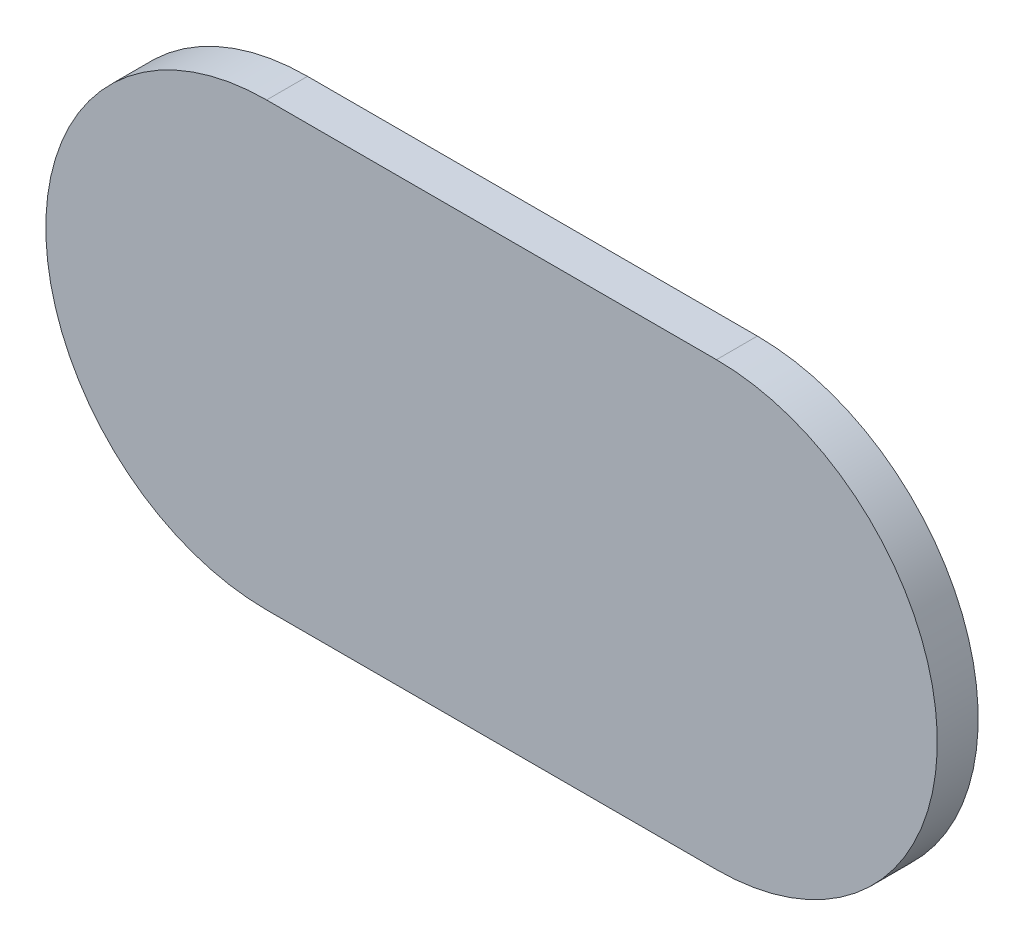
ISO-10303-21;
HEADER;
FILE_DESCRIPTION(('STEP AP214'),'2;1');
FILE_NAME('part.step','',(''),(''),'','','');
FILE_SCHEMA(('AUTOMOTIVE_DESIGN { 1 0 10303 214 1 1 1 1 }'));
ENDSEC;
DATA;
#1=APPLICATION_CONTEXT('core data for automotive mechanical design processes');
#2=APPLICATION_PROTOCOL_DEFINITION('international standard','automotive_design',2000,#1);
#3=PRODUCT_CONTEXT('',#1,'mechanical');
#4=PRODUCT('Part','Part','',(#3));
#5=PRODUCT_RELATED_PRODUCT_CATEGORY('part','',(#4));
#6=PRODUCT_DEFINITION_FORMATION('','',#4);
#7=PRODUCT_DEFINITION_CONTEXT('part definition',#1,'design');
#8=PRODUCT_DEFINITION('design','',#6,#7);
#9=PRODUCT_DEFINITION_SHAPE('','',#8);
#10=(LENGTH_UNIT() NAMED_UNIT(*) SI_UNIT(.MILLI.,.METRE.));
#11=(NAMED_UNIT(*) PLANE_ANGLE_UNIT() SI_UNIT($,.RADIAN.));
#12=(NAMED_UNIT(*) SI_UNIT($,.STERADIAN.) SOLID_ANGLE_UNIT());
#13=UNCERTAINTY_MEASURE_WITH_UNIT(LENGTH_MEASURE(1.E-05),#10,'distance_accuracy_value','');
#14=(GEOMETRIC_REPRESENTATION_CONTEXT(3) GLOBAL_UNCERTAINTY_ASSIGNED_CONTEXT((#13)) GLOBAL_UNIT_ASSIGNED_CONTEXT((#10,
#11,#12)) REPRESENTATION_CONTEXT('',''));
#15=CARTESIAN_POINT('',(0.,0.,0.));
#16=DIRECTION('',(0.,0.,1.));
#17=DIRECTION('',(1.,0.,0.));
#18=AXIS2_PLACEMENT_3D('',#15,#16,#17);
#19=CARTESIAN_POINT('',(2.75,0.,0.5));
#20=DIRECTION('',(0.,0.,-1.));
#21=DIRECTION('',(-1.,0.,0.));
#22=AXIS2_PLACEMENT_3D('',#19,#20,#21);
#23=CYLINDRICAL_SURFACE('',#22,2.7);
#24=CARTESIAN_POINT('',(2.75,0.,0.));
#25=DIRECTION('',(0.,0.,1.));
#26=DIRECTION('',(1.,0.,0.));
#27=AXIS2_PLACEMENT_3D('',#24,#25,#26);
#28=CIRCLE('',#27,2.7);
#29=CARTESIAN_POINT('',(2.75,-2.7,0.));
#30=VERTEX_POINT('',#29);
#31=CARTESIAN_POINT('',(2.75,2.7,0.));
#32=VERTEX_POINT('',#31);
#33=EDGE_CURVE('E104',#30,#32,#28,.T.);
#34=ORIENTED_EDGE('',*,*,#33,.T.);
#35=DIRECTION('',(0.,0.,-1.));
#36=VECTOR('',#35,1.);
#37=CARTESIAN_POINT('',(2.75,2.7,0.5));
#38=LINE('',#37,#36);
#39=CARTESIAN_POINT('',(2.75,2.7,0.5));
#40=VERTEX_POINT('',#39);
#41=EDGE_CURVE('E11',#40,#32,#38,.T.);
#42=ORIENTED_EDGE('',*,*,#41,.F.);
#43=CARTESIAN_POINT('',(2.75,0.,0.5));
#44=DIRECTION('',(0.,0.,1.));
#45=DIRECTION('',(1.,0.,0.));
#46=AXIS2_PLACEMENT_3D('',#43,#44,#45);
#47=CIRCLE('',#46,2.7);
#48=CARTESIAN_POINT('',(2.75,-2.7,0.5));
#49=VERTEX_POINT('',#48);
#50=EDGE_CURVE('E92',#49,#40,#47,.T.);
#51=ORIENTED_EDGE('',*,*,#50,.F.);
#52=DIRECTION('',(0.,0.,-1.));
#53=VECTOR('',#52,1.);
#54=CARTESIAN_POINT('',(2.75,-2.7,0.5));
#55=LINE('',#54,#53);
#56=EDGE_CURVE('E100',#49,#30,#55,.T.);
#57=ORIENTED_EDGE('',*,*,#56,.T.);
#58=EDGE_LOOP('',(#34,#42,#51,#57));
#59=FACE_BOUND('',#58,.T.);
#60=ADVANCED_FACE('F41',(#59),#23,.T.);
#61=CARTESIAN_POINT('',(2.75,2.7,0.5));
#62=DIRECTION('',(0.,-1.,0.));
#63=DIRECTION('',(1.,0.,0.));
#64=AXIS2_PLACEMENT_3D('',#61,#62,#63);
#65=PLANE('',#64);
#66=DIRECTION('',(-1.,0.,0.));
#67=VECTOR('',#66,1.);
#68=CARTESIAN_POINT('',(2.75,2.7,0.));
#69=LINE('',#68,#67);
#70=CARTESIAN_POINT('',(-2.75,2.7,0.));
#71=VERTEX_POINT('',#70);
#72=EDGE_CURVE('E96',#32,#71,#69,.T.);
#73=ORIENTED_EDGE('',*,*,#72,.T.);
#74=DIRECTION('',(0.,0.,-1.));
#75=VECTOR('',#74,1.);
#76=CARTESIAN_POINT('',(-2.75,2.7,0.5));
#77=LINE('',#76,#75);
#78=CARTESIAN_POINT('',(-2.75,2.7,0.5));
#79=VERTEX_POINT('',#78);
#80=EDGE_CURVE('E49',#79,#71,#77,.T.);
#81=ORIENTED_EDGE('',*,*,#80,.F.);
#82=DIRECTION('',(-1.,0.,0.));
#83=VECTOR('',#82,1.);
#84=CARTESIAN_POINT('',(2.75,2.7,0.5));
#85=LINE('',#84,#83);
#86=EDGE_CURVE('E87',#40,#79,#85,.T.);
#87=ORIENTED_EDGE('',*,*,#86,.F.);
#88=ORIENTED_EDGE('',*,*,#41,.T.);
#89=EDGE_LOOP('',(#73,#81,#87,#88));
#90=FACE_BOUND('',#89,.T.);
#91=ADVANCED_FACE('F95',(#90),#65,.F.);
#92=CARTESIAN_POINT('',(-2.75,0.,0.5));
#93=DIRECTION('',(0.,0.,-1.));
#94=DIRECTION('',(-1.,0.,0.));
#95=AXIS2_PLACEMENT_3D('',#92,#93,#94);
#96=CYLINDRICAL_SURFACE('',#95,2.7);
#97=CARTESIAN_POINT('',(-2.75,0.,0.));
#98=DIRECTION('',(0.,0.,1.));
#99=DIRECTION('',(1.,0.,0.));
#100=AXIS2_PLACEMENT_3D('',#97,#98,#99);
#101=CIRCLE('',#100,2.7);
#102=CARTESIAN_POINT('',(-2.75,-2.7,0.));
#103=VERTEX_POINT('',#102);
#104=EDGE_CURVE('E74',#71,#103,#101,.T.);
#105=ORIENTED_EDGE('',*,*,#104,.T.);
#106=DIRECTION('',(0.,0.,-1.));
#107=VECTOR('',#106,1.);
#108=CARTESIAN_POINT('',(-2.75,-2.7,0.5));
#109=LINE('',#108,#107);
#110=CARTESIAN_POINT('',(-2.75,-2.7,0.5));
#111=VERTEX_POINT('',#110);
#112=EDGE_CURVE('E97',#111,#103,#109,.T.);
#113=ORIENTED_EDGE('',*,*,#112,.F.);
#114=CARTESIAN_POINT('',(-2.75,0.,0.5));
#115=DIRECTION('',(0.,0.,1.));
#116=DIRECTION('',(1.,0.,0.));
#117=AXIS2_PLACEMENT_3D('',#114,#115,#116);
#118=CIRCLE('',#117,2.7);
#119=EDGE_CURVE('E90',#79,#111,#118,.T.);
#120=ORIENTED_EDGE('',*,*,#119,.F.);
#121=ORIENTED_EDGE('',*,*,#80,.T.);
#122=EDGE_LOOP('',(#105,#113,#120,#121));
#123=FACE_BOUND('',#122,.T.);
#124=ADVANCED_FACE('F98',(#123),#96,.T.);
#125=CARTESIAN_POINT('',(2.75,-2.7,0.5));
#126=DIRECTION('',(0.,1.,0.));
#127=DIRECTION('',(-1.,0.,0.));
#128=AXIS2_PLACEMENT_3D('',#125,#126,#127);
#129=PLANE('',#128);
#130=DIRECTION('',(1.,0.,0.));
#131=VECTOR('',#130,1.);
#132=CARTESIAN_POINT('',(2.75,-2.7,0.));
#133=LINE('',#132,#131);
#134=EDGE_CURVE('E80',#103,#30,#133,.T.);
#135=ORIENTED_EDGE('',*,*,#134,.T.);
#136=ORIENTED_EDGE('',*,*,#56,.F.);
#137=DIRECTION('',(1.,0.,0.));
#138=VECTOR('',#137,1.);
#139=CARTESIAN_POINT('',(2.75,-2.7,0.5));
#140=LINE('',#139,#138);
#141=EDGE_CURVE('E57',#111,#49,#140,.T.);
#142=ORIENTED_EDGE('',*,*,#141,.F.);
#143=ORIENTED_EDGE('',*,*,#112,.T.);
#144=EDGE_LOOP('',(#135,#136,#142,#143));
#145=FACE_BOUND('',#144,.T.);
#146=ADVANCED_FACE('F111',(#145),#129,.F.);
#147=CARTESIAN_POINT('',(2.75,0.,0.5));
#148=DIRECTION('',(0.,0.,1.));
#149=DIRECTION('',(1.,0.,0.));
#150=AXIS2_PLACEMENT_3D('',#147,#148,#149);
#151=PLANE('',#150);
#152=ORIENTED_EDGE('',*,*,#50,.T.);
#153=ORIENTED_EDGE('',*,*,#86,.T.);
#154=ORIENTED_EDGE('',*,*,#119,.T.);
#155=ORIENTED_EDGE('',*,*,#141,.T.);
#156=EDGE_LOOP('',(#152,#153,#154,#155));
#157=FACE_BOUND('',#156,.T.);
#158=ADVANCED_FACE('F88',(#157),#151,.T.);
#159=CARTESIAN_POINT('',(2.75,0.,0.));
#160=DIRECTION('',(0.,0.,1.));
#161=DIRECTION('',(1.,0.,0.));
#162=AXIS2_PLACEMENT_3D('',#159,#160,#161);
#163=PLANE('',#162);
#164=ORIENTED_EDGE('',*,*,#33,.F.);
#165=ORIENTED_EDGE('',*,*,#134,.F.);
#166=ORIENTED_EDGE('',*,*,#104,.F.);
#167=ORIENTED_EDGE('',*,*,#72,.F.);
#168=EDGE_LOOP('',(#164,#165,#166,#167));
#169=FACE_BOUND('',#168,.T.);
#170=ADVANCED_FACE('F114',(#169),#163,.F.);
#171=CLOSED_SHELL('',(#60,#91,#124,#146,#158,#170));
#172=MANIFOLD_SOLID_BREP('B2',#171);
#173=ADVANCED_BREP_SHAPE_REPRESENTATION('',(#18,#172),#14);
#174=SHAPE_DEFINITION_REPRESENTATION(#9,#173);
ENDSEC;
END-ISO-10303-21;
